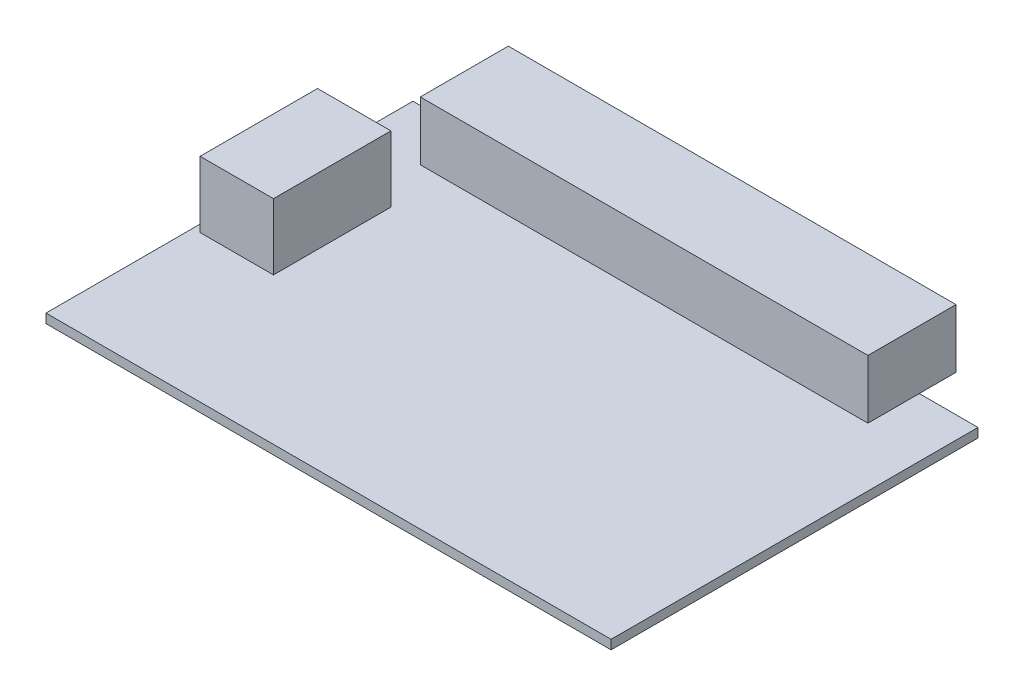
ISO-10303-21;
HEADER;
FILE_DESCRIPTION(('STEP AP214'),'2;1');
FILE_NAME('part.step','',(''),(''),'','','');
FILE_SCHEMA(('AUTOMOTIVE_DESIGN { 1 0 10303 214 1 1 1 1 }'));
ENDSEC;
DATA;
#1=APPLICATION_CONTEXT('core data for automotive mechanical design processes');
#2=APPLICATION_PROTOCOL_DEFINITION('international standard','automotive_design',2000,#1);
#3=PRODUCT_CONTEXT('',#1,'mechanical');
#4=PRODUCT('Part','Part','',(#3));
#5=PRODUCT_RELATED_PRODUCT_CATEGORY('part','',(#4));
#6=PRODUCT_DEFINITION_FORMATION('','',#4);
#7=PRODUCT_DEFINITION_CONTEXT('part definition',#1,'design');
#8=PRODUCT_DEFINITION('design','',#6,#7);
#9=PRODUCT_DEFINITION_SHAPE('','',#8);
#10=(LENGTH_UNIT() NAMED_UNIT(*) SI_UNIT(.MILLI.,.METRE.));
#11=(NAMED_UNIT(*) PLANE_ANGLE_UNIT() SI_UNIT($,.RADIAN.));
#12=(NAMED_UNIT(*) SI_UNIT($,.STERADIAN.) SOLID_ANGLE_UNIT());
#13=UNCERTAINTY_MEASURE_WITH_UNIT(LENGTH_MEASURE(1.E-05),#10,'distance_accuracy_value','');
#14=(GEOMETRIC_REPRESENTATION_CONTEXT(3) GLOBAL_UNCERTAINTY_ASSIGNED_CONTEXT((#13)) GLOBAL_UNIT_ASSIGNED_CONTEXT((#10,
#11,#12)) REPRESENTATION_CONTEXT('',''));
#15=CARTESIAN_POINT('',(0.,0.,0.));
#16=DIRECTION('',(0.,0.,1.));
#17=DIRECTION('',(1.,0.,0.));
#18=AXIS2_PLACEMENT_3D('',#15,#16,#17);
#19=CARTESIAN_POINT('',(0.,1.25,0.));
#20=DIRECTION('',(0.,-1.,0.));
#21=DIRECTION('',(0.,0.,-1.));
#22=AXIS2_PLACEMENT_3D('',#19,#20,#21);
#23=PLANE('',#22);
#24=DIRECTION('',(1.,0.,0.));
#25=VECTOR('',#24,1.);
#26=CARTESIAN_POINT('',(-30.5,1.25,-18.));
#27=LINE('',#26,#25);
#28=CARTESIAN_POINT('',(-30.5,1.25,-18.));
#29=VERTEX_POINT('',#28);
#30=CARTESIAN_POINT('',(30.5,1.25,-18.));
#31=VERTEX_POINT('',#30);
#32=EDGE_CURVE('E170',#29,#31,#27,.T.);
#33=ORIENTED_EDGE('',*,*,#32,.F.);
#34=DIRECTION('',(0.,0.,-1.));
#35=VECTOR('',#34,1.);
#36=CARTESIAN_POINT('',(-30.5,1.25,-18.));
#37=LINE('',#36,#35);
#38=CARTESIAN_POINT('',(-30.5,1.25,-25.));
#39=VERTEX_POINT('',#38);
#40=EDGE_CURVE('E176',#29,#39,#37,.T.);
#41=ORIENTED_EDGE('',*,*,#40,.T.);
#42=DIRECTION('',(1.,0.,0.));
#43=VECTOR('',#42,1.);
#44=CARTESIAN_POINT('',(-38.5,1.25,-25.));
#45=LINE('',#44,#43);
#46=CARTESIAN_POINT('',(-38.5,1.25,-25.));
#47=VERTEX_POINT('',#46);
#48=EDGE_CURVE('E223',#47,#39,#45,.T.);
#49=ORIENTED_EDGE('',*,*,#48,.F.);
#50=DIRECTION('',(0.,0.,-1.));
#51=VECTOR('',#50,1.);
#52=CARTESIAN_POINT('',(-38.5,1.25,25.));
#53=LINE('',#52,#51);
#54=CARTESIAN_POINT('',(-38.5,1.25,25.));
#55=VERTEX_POINT('',#54);
#56=EDGE_CURVE('E218',#55,#47,#53,.T.);
#57=ORIENTED_EDGE('',*,*,#56,.F.);
#58=DIRECTION('',(1.,0.,0.));
#59=VECTOR('',#58,1.);
#60=CARTESIAN_POINT('',(-38.5,1.25,25.));
#61=LINE('',#60,#59);
#62=CARTESIAN_POINT('',(38.5,1.25,25.));
#63=VERTEX_POINT('',#62);
#64=EDGE_CURVE('E230',#55,#63,#61,.T.);
#65=ORIENTED_EDGE('',*,*,#64,.T.);
#66=DIRECTION('',(0.,0.,-1.));
#67=VECTOR('',#66,1.);
#68=CARTESIAN_POINT('',(38.5,1.25,25.));
#69=LINE('',#68,#67);
#70=CARTESIAN_POINT('',(38.5,1.25,-25.));
#71=VERTEX_POINT('',#70);
#72=EDGE_CURVE('E226',#63,#71,#69,.T.);
#73=ORIENTED_EDGE('',*,*,#72,.T.);
#74=CARTESIAN_POINT('',(30.5,1.25,-25.));
#75=VERTEX_POINT('',#74);
#76=EDGE_CURVE('E221',#75,#71,#45,.T.);
#77=ORIENTED_EDGE('',*,*,#76,.F.);
#78=DIRECTION('',(0.,0.,-1.));
#79=VECTOR('',#78,1.);
#80=CARTESIAN_POINT('',(30.5,1.25,-18.));
#81=LINE('',#80,#79);
#82=EDGE_CURVE('E64',#31,#75,#81,.T.);
#83=ORIENTED_EDGE('',*,*,#82,.F.);
#84=EDGE_LOOP('',(#33,#41,#49,#57,#65,#73,#77,#83));
#85=FACE_BOUND('',#84,.T.);
#86=DIRECTION('',(0.,0.,1.));
#87=VECTOR('',#86,1.);
#88=CARTESIAN_POINT('',(-37.5,1.25,-11.));
#89=LINE('',#88,#87);
#90=CARTESIAN_POINT('',(-37.5,1.25,-11.));
#91=VERTEX_POINT('',#90);
#92=CARTESIAN_POINT('',(-37.5,1.25,4.99999999999999));
#93=VERTEX_POINT('',#92);
#94=EDGE_CURVE('E184',#91,#93,#89,.T.);
#95=ORIENTED_EDGE('',*,*,#94,.F.);
#96=DIRECTION('',(-1.,0.,0.));
#97=VECTOR('',#96,1.);
#98=CARTESIAN_POINT('',(-37.5,1.25,-11.));
#99=LINE('',#98,#97);
#100=CARTESIAN_POINT('',(-27.5,1.25,-11.));
#101=VERTEX_POINT('',#100);
#102=EDGE_CURVE('E192',#101,#91,#99,.T.);
#103=ORIENTED_EDGE('',*,*,#102,.F.);
#104=DIRECTION('',(0.,0.,-1.));
#105=VECTOR('',#104,1.);
#106=CARTESIAN_POINT('',(-27.5,1.25,-11.));
#107=LINE('',#106,#105);
#108=CARTESIAN_POINT('',(-27.5,1.25,4.99999999999999));
#109=VERTEX_POINT('',#108);
#110=EDGE_CURVE('E202',#109,#101,#107,.T.);
#111=ORIENTED_EDGE('',*,*,#110,.F.);
#112=DIRECTION('',(1.,0.,0.));
#113=VECTOR('',#112,1.);
#114=CARTESIAN_POINT('',(-37.5,1.25,4.99999999999999));
#115=LINE('',#114,#113);
#116=EDGE_CURVE('E72',#93,#109,#115,.T.);
#117=ORIENTED_EDGE('',*,*,#116,.F.);
#118=EDGE_LOOP('',(#95,#103,#111,#117));
#119=FACE_BOUND('',#118,.T.);
#120=ADVANCED_FACE('F47',(#85,#119),#23,.F.);
#121=CARTESIAN_POINT('',(-38.5,1.25,25.));
#122=DIRECTION('',(-1.,0.,0.));
#123=DIRECTION('',(0.,0.,1.));
#124=AXIS2_PLACEMENT_3D('',#121,#122,#123);
#125=PLANE('',#124);
#126=DIRECTION('',(0.,0.,-1.));
#127=VECTOR('',#126,1.);
#128=CARTESIAN_POINT('',(-38.5,0.,25.));
#129=LINE('',#128,#127);
#130=CARTESIAN_POINT('',(-38.5,0.,25.));
#131=VERTEX_POINT('',#130);
#132=CARTESIAN_POINT('',(-38.5,0.,-25.));
#133=VERTEX_POINT('',#132);
#134=EDGE_CURVE('E217',#131,#133,#129,.T.);
#135=ORIENTED_EDGE('',*,*,#134,.F.);
#136=DIRECTION('',(0.,-1.,0.));
#137=VECTOR('',#136,1.);
#138=CARTESIAN_POINT('',(-38.5,1.25,25.));
#139=LINE('',#138,#137);
#140=EDGE_CURVE('E11',#55,#131,#139,.T.);
#141=ORIENTED_EDGE('',*,*,#140,.F.);
#142=ORIENTED_EDGE('',*,*,#56,.T.);
#143=DIRECTION('',(0.,-1.,0.));
#144=VECTOR('',#143,1.);
#145=CARTESIAN_POINT('',(-38.5,1.25,-25.));
#146=LINE('',#145,#144);
#147=EDGE_CURVE('E51',#47,#133,#146,.T.);
#148=ORIENTED_EDGE('',*,*,#147,.T.);
#149=EDGE_LOOP('',(#135,#141,#142,#148));
#150=FACE_BOUND('',#149,.T.);
#151=ADVANCED_FACE('F49',(#150),#125,.T.);
#152=CARTESIAN_POINT('',(-38.5,1.25,25.));
#153=DIRECTION('',(0.,0.,-1.));
#154=DIRECTION('',(-1.,0.,0.));
#155=AXIS2_PLACEMENT_3D('',#152,#153,#154);
#156=PLANE('',#155);
#157=DIRECTION('',(1.,0.,0.));
#158=VECTOR('',#157,1.);
#159=CARTESIAN_POINT('',(-38.5,0.,25.));
#160=LINE('',#159,#158);
#161=CARTESIAN_POINT('',(38.5,0.,25.));
#162=VERTEX_POINT('',#161);
#163=EDGE_CURVE('E222',#131,#162,#160,.T.);
#164=ORIENTED_EDGE('',*,*,#163,.T.);
#165=DIRECTION('',(0.,-1.,0.));
#166=VECTOR('',#165,1.);
#167=CARTESIAN_POINT('',(38.5,1.25,25.));
#168=LINE('',#167,#166);
#169=EDGE_CURVE('E56',#63,#162,#168,.T.);
#170=ORIENTED_EDGE('',*,*,#169,.F.);
#171=ORIENTED_EDGE('',*,*,#64,.F.);
#172=ORIENTED_EDGE('',*,*,#140,.T.);
#173=EDGE_LOOP('',(#164,#170,#171,#172));
#174=FACE_BOUND('',#173,.T.);
#175=ADVANCED_FACE('F257',(#174),#156,.F.);
#176=CARTESIAN_POINT('',(38.5,1.25,25.));
#177=DIRECTION('',(-1.,0.,0.));
#178=DIRECTION('',(0.,0.,1.));
#179=AXIS2_PLACEMENT_3D('',#176,#177,#178);
#180=PLANE('',#179);
#181=DIRECTION('',(0.,0.,-1.));
#182=VECTOR('',#181,1.);
#183=CARTESIAN_POINT('',(38.5,0.,25.));
#184=LINE('',#183,#182);
#185=CARTESIAN_POINT('',(38.5,0.,-25.));
#186=VERTEX_POINT('',#185);
#187=EDGE_CURVE('E237',#162,#186,#184,.T.);
#188=ORIENTED_EDGE('',*,*,#187,.T.);
#189=DIRECTION('',(0.,-1.,0.));
#190=VECTOR('',#189,1.);
#191=CARTESIAN_POINT('',(38.5,1.25,-25.));
#192=LINE('',#191,#190);
#193=EDGE_CURVE('E242',#71,#186,#192,.T.);
#194=ORIENTED_EDGE('',*,*,#193,.F.);
#195=ORIENTED_EDGE('',*,*,#72,.F.);
#196=ORIENTED_EDGE('',*,*,#169,.T.);
#197=EDGE_LOOP('',(#188,#194,#195,#196));
#198=FACE_BOUND('',#197,.T.);
#199=ADVANCED_FACE('F261',(#198),#180,.F.);
#200=CARTESIAN_POINT('',(-38.5,1.25,-25.));
#201=DIRECTION('',(0.,0.,-1.));
#202=DIRECTION('',(-1.,0.,0.));
#203=AXIS2_PLACEMENT_3D('',#200,#201,#202);
#204=PLANE('',#203);
#205=DIRECTION('',(1.,0.,0.));
#206=VECTOR('',#205,1.);
#207=CARTESIAN_POINT('',(-38.5,0.,-25.));
#208=LINE('',#207,#206);
#209=EDGE_CURVE('E234',#133,#186,#208,.T.);
#210=ORIENTED_EDGE('',*,*,#209,.F.);
#211=ORIENTED_EDGE('',*,*,#147,.F.);
#212=ORIENTED_EDGE('',*,*,#48,.T.);
#213=EDGE_CURVE('E227',#39,#75,#45,.T.);
#214=ORIENTED_EDGE('',*,*,#213,.T.);
#215=ORIENTED_EDGE('',*,*,#76,.T.);
#216=ORIENTED_EDGE('',*,*,#193,.T.);
#217=EDGE_LOOP('',(#210,#211,#212,#214,#215,#216));
#218=FACE_BOUND('',#217,.T.);
#219=ADVANCED_FACE('F250',(#218),#204,.T.);
#220=CARTESIAN_POINT('',(0.,0.,0.));
#221=DIRECTION('',(0.,-1.,0.));
#222=DIRECTION('',(0.,0.,-1.));
#223=AXIS2_PLACEMENT_3D('',#220,#221,#222);
#224=PLANE('',#223);
#225=ORIENTED_EDGE('',*,*,#134,.T.);
#226=ORIENTED_EDGE('',*,*,#209,.T.);
#227=ORIENTED_EDGE('',*,*,#187,.F.);
#228=ORIENTED_EDGE('',*,*,#163,.F.);
#229=EDGE_LOOP('',(#225,#226,#227,#228));
#230=FACE_BOUND('',#229,.T.);
#231=ADVANCED_FACE('F254',(#230),#224,.T.);
#232=CARTESIAN_POINT('',(-37.5,10.25,-11.));
#233=DIRECTION('',(1.,0.,0.));
#234=DIRECTION('',(0.,0.,-1.));
#235=AXIS2_PLACEMENT_3D('',#232,#233,#234);
#236=PLANE('',#235);
#237=ORIENTED_EDGE('',*,*,#94,.T.);
#238=DIRECTION('',(0.,-1.,0.));
#239=VECTOR('',#238,1.);
#240=CARTESIAN_POINT('',(-37.5,10.25,4.99999999999999));
#241=LINE('',#240,#239);
#242=CARTESIAN_POINT('',(-37.5,10.25,4.99999999999999));
#243=VERTEX_POINT('',#242);
#244=EDGE_CURVE('E215',#243,#93,#241,.T.);
#245=ORIENTED_EDGE('',*,*,#244,.F.);
#246=DIRECTION('',(0.,0.,1.));
#247=VECTOR('',#246,1.);
#248=CARTESIAN_POINT('',(-37.5,10.25,-11.));
#249=LINE('',#248,#247);
#250=CARTESIAN_POINT('',(-37.5,10.25,-11.));
#251=VERTEX_POINT('',#250);
#252=EDGE_CURVE('E188',#251,#243,#249,.T.);
#253=ORIENTED_EDGE('',*,*,#252,.F.);
#254=DIRECTION('',(0.,-1.,0.));
#255=VECTOR('',#254,1.);
#256=CARTESIAN_POINT('',(-37.5,10.25,-11.));
#257=LINE('',#256,#255);
#258=EDGE_CURVE('E198',#251,#91,#257,.T.);
#259=ORIENTED_EDGE('',*,*,#258,.T.);
#260=EDGE_LOOP('',(#237,#245,#253,#259));
#261=FACE_BOUND('',#260,.T.);
#262=ADVANCED_FACE('F287',(#261),#236,.F.);
#263=CARTESIAN_POINT('',(-37.5,10.25,4.99999999999999));
#264=DIRECTION('',(0.,0.,-1.));
#265=DIRECTION('',(-1.,0.,0.));
#266=AXIS2_PLACEMENT_3D('',#263,#264,#265);
#267=PLANE('',#266);
#268=ORIENTED_EDGE('',*,*,#116,.T.);
#269=DIRECTION('',(0.,-1.,0.));
#270=VECTOR('',#269,1.);
#271=CARTESIAN_POINT('',(-27.5,10.25,4.99999999999999));
#272=LINE('',#271,#270);
#273=CARTESIAN_POINT('',(-27.5,10.25,4.99999999999999));
#274=VERTEX_POINT('',#273);
#275=EDGE_CURVE('E212',#274,#109,#272,.T.);
#276=ORIENTED_EDGE('',*,*,#275,.F.);
#277=DIRECTION('',(1.,0.,0.));
#278=VECTOR('',#277,1.);
#279=CARTESIAN_POINT('',(-37.5,10.25,4.99999999999999));
#280=LINE('',#279,#278);
#281=EDGE_CURVE('E191',#243,#274,#280,.T.);
#282=ORIENTED_EDGE('',*,*,#281,.F.);
#283=ORIENTED_EDGE('',*,*,#244,.T.);
#284=EDGE_LOOP('',(#268,#276,#282,#283));
#285=FACE_BOUND('',#284,.T.);
#286=ADVANCED_FACE('F309',(#285),#267,.F.);
#287=CARTESIAN_POINT('',(-27.5,10.25,-11.));
#288=DIRECTION('',(-1.,0.,0.));
#289=DIRECTION('',(0.,0.,1.));
#290=AXIS2_PLACEMENT_3D('',#287,#288,#289);
#291=PLANE('',#290);
#292=ORIENTED_EDGE('',*,*,#110,.T.);
#293=DIRECTION('',(0.,-1.,0.));
#294=VECTOR('',#293,1.);
#295=CARTESIAN_POINT('',(-27.5,10.25,-11.));
#296=LINE('',#295,#294);
#297=CARTESIAN_POINT('',(-27.5,10.25,-11.));
#298=VERTEX_POINT('',#297);
#299=EDGE_CURVE('E209',#298,#101,#296,.T.);
#300=ORIENTED_EDGE('',*,*,#299,.F.);
#301=DIRECTION('',(0.,0.,-1.));
#302=VECTOR('',#301,1.);
#303=CARTESIAN_POINT('',(-27.5,10.25,-11.));
#304=LINE('',#303,#302);
#305=EDGE_CURVE('E194',#274,#298,#304,.T.);
#306=ORIENTED_EDGE('',*,*,#305,.F.);
#307=ORIENTED_EDGE('',*,*,#275,.T.);
#308=EDGE_LOOP('',(#292,#300,#306,#307));
#309=FACE_BOUND('',#308,.T.);
#310=ADVANCED_FACE('F316',(#309),#291,.F.);
#311=CARTESIAN_POINT('',(-37.5,10.25,-11.));
#312=DIRECTION('',(0.,0.,1.));
#313=DIRECTION('',(1.,0.,0.));
#314=AXIS2_PLACEMENT_3D('',#311,#312,#313);
#315=PLANE('',#314);
#316=ORIENTED_EDGE('',*,*,#102,.T.);
#317=ORIENTED_EDGE('',*,*,#258,.F.);
#318=DIRECTION('',(-1.,0.,0.));
#319=VECTOR('',#318,1.);
#320=CARTESIAN_POINT('',(-37.5,10.25,-11.));
#321=LINE('',#320,#319);
#322=EDGE_CURVE('E196',#298,#251,#321,.T.);
#323=ORIENTED_EDGE('',*,*,#322,.F.);
#324=ORIENTED_EDGE('',*,*,#299,.T.);
#325=EDGE_LOOP('',(#316,#317,#323,#324));
#326=FACE_BOUND('',#325,.T.);
#327=ADVANCED_FACE('F323',(#326),#315,.F.);
#328=CARTESIAN_POINT('',(0.,10.25,0.));
#329=DIRECTION('',(0.,1.,0.));
#330=DIRECTION('',(0.,0.,1.));
#331=AXIS2_PLACEMENT_3D('',#328,#329,#330);
#332=PLANE('',#331);
#333=ORIENTED_EDGE('',*,*,#252,.T.);
#334=ORIENTED_EDGE('',*,*,#281,.T.);
#335=ORIENTED_EDGE('',*,*,#305,.T.);
#336=ORIENTED_EDGE('',*,*,#322,.T.);
#337=EDGE_LOOP('',(#333,#334,#335,#336));
#338=FACE_BOUND('',#337,.T.);
#339=ADVANCED_FACE('F331',(#338),#332,.T.);
#340=CARTESIAN_POINT('',(-30.5,9.25,-18.));
#341=DIRECTION('',(-1.,0.,0.));
#342=DIRECTION('',(0.,0.,1.));
#343=AXIS2_PLACEMENT_3D('',#340,#341,#342);
#344=PLANE('',#343);
#345=ORIENTED_EDGE('',*,*,#40,.F.);
#346=DIRECTION('',(0.,-1.,0.));
#347=VECTOR('',#346,1.);
#348=CARTESIAN_POINT('',(-30.5,9.25,-18.));
#349=LINE('',#348,#347);
#350=CARTESIAN_POINT('',(-30.5,9.25,-18.));
#351=VERTEX_POINT('',#350);
#352=EDGE_CURVE('E168',#351,#29,#349,.T.);
#353=ORIENTED_EDGE('',*,*,#352,.F.);
#354=DIRECTION('',(0.,0.,-1.));
#355=VECTOR('',#354,1.);
#356=CARTESIAN_POINT('',(-30.5,9.25,-18.));
#357=LINE('',#356,#355);
#358=CARTESIAN_POINT('',(-30.5,9.25,-30.));
#359=VERTEX_POINT('',#358);
#360=EDGE_CURVE('E161',#351,#359,#357,.T.);
#361=ORIENTED_EDGE('',*,*,#360,.T.);
#362=DIRECTION('',(0.,-1.,0.));
#363=VECTOR('',#362,1.);
#364=CARTESIAN_POINT('',(-30.5,9.25,-30.));
#365=LINE('',#364,#363);
#366=CARTESIAN_POINT('',(-30.5,1.25,-30.));
#367=VERTEX_POINT('',#366);
#368=EDGE_CURVE('E145',#359,#367,#365,.T.);
#369=ORIENTED_EDGE('',*,*,#368,.T.);
#370=EDGE_CURVE('E179',#39,#367,#37,.T.);
#371=ORIENTED_EDGE('',*,*,#370,.F.);
#372=EDGE_LOOP('',(#345,#353,#361,#369,#371));
#373=FACE_BOUND('',#372,.T.);
#374=ADVANCED_FACE('F167',(#373),#344,.T.);
#375=CARTESIAN_POINT('',(-30.5,9.25,-18.));
#376=DIRECTION('',(0.,0.,-1.));
#377=DIRECTION('',(-1.,0.,0.));
#378=AXIS2_PLACEMENT_3D('',#375,#376,#377);
#379=PLANE('',#378);
#380=ORIENTED_EDGE('',*,*,#32,.T.);
#381=DIRECTION('',(0.,-1.,0.));
#382=VECTOR('',#381,1.);
#383=CARTESIAN_POINT('',(30.5,9.25,-18.));
#384=LINE('',#383,#382);
#385=CARTESIAN_POINT('',(30.5,9.25,-18.));
#386=VERTEX_POINT('',#385);
#387=EDGE_CURVE('E185',#386,#31,#384,.T.);
#388=ORIENTED_EDGE('',*,*,#387,.F.);
#389=DIRECTION('',(1.,0.,0.));
#390=VECTOR('',#389,1.);
#391=CARTESIAN_POINT('',(-30.5,9.25,-18.));
#392=LINE('',#391,#390);
#393=EDGE_CURVE('E156',#351,#386,#392,.T.);
#394=ORIENTED_EDGE('',*,*,#393,.F.);
#395=ORIENTED_EDGE('',*,*,#352,.T.);
#396=EDGE_LOOP('',(#380,#388,#394,#395));
#397=FACE_BOUND('',#396,.T.);
#398=ADVANCED_FACE('F270',(#397),#379,.F.);
#399=CARTESIAN_POINT('',(30.5,9.25,-18.));
#400=DIRECTION('',(-1.,0.,0.));
#401=DIRECTION('',(0.,0.,1.));
#402=AXIS2_PLACEMENT_3D('',#399,#400,#401);
#403=PLANE('',#402);
#404=ORIENTED_EDGE('',*,*,#82,.T.);
#405=CARTESIAN_POINT('',(30.5,1.25,-30.));
#406=VERTEX_POINT('',#405);
#407=EDGE_CURVE('E181',#75,#406,#81,.T.);
#408=ORIENTED_EDGE('',*,*,#407,.T.);
#409=DIRECTION('',(0.,-1.,0.));
#410=VECTOR('',#409,1.);
#411=CARTESIAN_POINT('',(30.5,9.25,-30.));
#412=LINE('',#411,#410);
#413=CARTESIAN_POINT('',(30.5,9.25,-30.));
#414=VERTEX_POINT('',#413);
#415=EDGE_CURVE('E155',#414,#406,#412,.T.);
#416=ORIENTED_EDGE('',*,*,#415,.F.);
#417=DIRECTION('',(0.,0.,-1.));
#418=VECTOR('',#417,1.);
#419=CARTESIAN_POINT('',(30.5,9.25,-18.));
#420=LINE('',#419,#418);
#421=EDGE_CURVE('E163',#386,#414,#420,.T.);
#422=ORIENTED_EDGE('',*,*,#421,.F.);
#423=ORIENTED_EDGE('',*,*,#387,.T.);
#424=EDGE_LOOP('',(#404,#408,#416,#422,#423));
#425=FACE_BOUND('',#424,.T.);
#426=ADVANCED_FACE('F271',(#425),#403,.F.);
#427=CARTESIAN_POINT('',(-30.5,9.25,-30.));
#428=DIRECTION('',(0.,0.,-1.));
#429=DIRECTION('',(-1.,0.,0.));
#430=AXIS2_PLACEMENT_3D('',#427,#428,#429);
#431=PLANE('',#430);
#432=DIRECTION('',(1.,0.,0.));
#433=VECTOR('',#432,1.);
#434=CARTESIAN_POINT('',(-30.5,1.25,-30.));
#435=LINE('',#434,#433);
#436=EDGE_CURVE('E151',#367,#406,#435,.T.);
#437=ORIENTED_EDGE('',*,*,#436,.F.);
#438=ORIENTED_EDGE('',*,*,#368,.F.);
#439=DIRECTION('',(1.,0.,0.));
#440=VECTOR('',#439,1.);
#441=CARTESIAN_POINT('',(-30.5,9.25,-30.));
#442=LINE('',#441,#440);
#443=EDGE_CURVE('E149',#359,#414,#442,.T.);
#444=ORIENTED_EDGE('',*,*,#443,.T.);
#445=ORIENTED_EDGE('',*,*,#415,.T.);
#446=EDGE_LOOP('',(#437,#438,#444,#445));
#447=FACE_BOUND('',#446,.T.);
#448=ADVANCED_FACE('F147',(#447),#431,.T.);
#449=CARTESIAN_POINT('',(0.,9.25,0.));
#450=DIRECTION('',(0.,-1.,0.));
#451=DIRECTION('',(0.,0.,-1.));
#452=AXIS2_PLACEMENT_3D('',#449,#450,#451);
#453=PLANE('',#452);
#454=ORIENTED_EDGE('',*,*,#360,.F.);
#455=ORIENTED_EDGE('',*,*,#393,.T.);
#456=ORIENTED_EDGE('',*,*,#421,.T.);
#457=ORIENTED_EDGE('',*,*,#443,.F.);
#458=EDGE_LOOP('',(#454,#455,#456,#457));
#459=FACE_BOUND('',#458,.T.);
#460=ADVANCED_FACE('F160',(#459),#453,.F.);
#461=CARTESIAN_POINT('',(0.,1.25,0.));
#462=DIRECTION('',(0.,-1.,0.));
#463=DIRECTION('',(0.,0.,-1.));
#464=AXIS2_PLACEMENT_3D('',#461,#462,#463);
#465=PLANE('',#464);
#466=ORIENTED_EDGE('',*,*,#407,.F.);
#467=ORIENTED_EDGE('',*,*,#213,.F.);
#468=ORIENTED_EDGE('',*,*,#370,.T.);
#469=ORIENTED_EDGE('',*,*,#436,.T.);
#470=EDGE_LOOP('',(#466,#467,#468,#469));
#471=FACE_BOUND('',#470,.T.);
#472=ADVANCED_FACE('F267',(#471),#465,.T.);
#473=CLOSED_SHELL('',(#120,#151,#175,#199,#219,#231,#262,#286,#310,#327,#339,#374,#398,#426,
#448,#460,#472));
#474=MANIFOLD_SOLID_BREP('B2',#473);
#475=ADVANCED_BREP_SHAPE_REPRESENTATION('',(#18,#474),#14);
#476=SHAPE_DEFINITION_REPRESENTATION(#9,#475);
ENDSEC;
END-ISO-10303-21;
